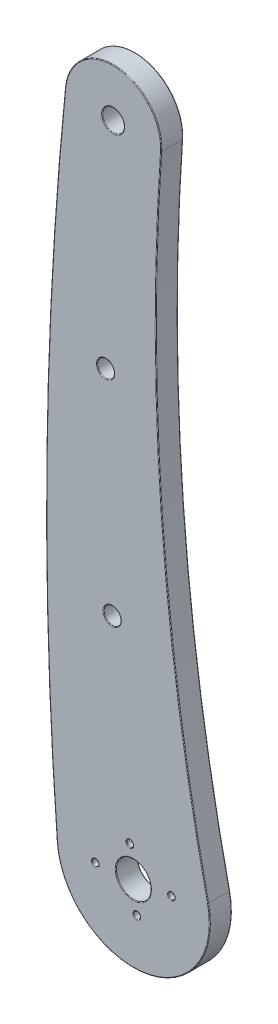
ISO-10303-21;
HEADER;
FILE_DESCRIPTION(('STEP AP214'),'2;1');
FILE_NAME('part.step','',(''),(''),'','','');
FILE_SCHEMA(('AUTOMOTIVE_DESIGN { 1 0 10303 214 1 1 1 1 }'));
ENDSEC;
DATA;
#1=APPLICATION_CONTEXT('core data for automotive mechanical design processes');
#2=APPLICATION_PROTOCOL_DEFINITION('international standard','automotive_design',2000,#1);
#3=PRODUCT_CONTEXT('',#1,'mechanical');
#4=PRODUCT('Part','Part','',(#3));
#5=PRODUCT_RELATED_PRODUCT_CATEGORY('part','',(#4));
#6=PRODUCT_DEFINITION_FORMATION('','',#4);
#7=PRODUCT_DEFINITION_CONTEXT('part definition',#1,'design');
#8=PRODUCT_DEFINITION('design','',#6,#7);
#9=PRODUCT_DEFINITION_SHAPE('','',#8);
#10=(LENGTH_UNIT() NAMED_UNIT(*) SI_UNIT(.MILLI.,.METRE.));
#11=(NAMED_UNIT(*) PLANE_ANGLE_UNIT() SI_UNIT($,.RADIAN.));
#12=(NAMED_UNIT(*) SI_UNIT($,.STERADIAN.) SOLID_ANGLE_UNIT());
#13=UNCERTAINTY_MEASURE_WITH_UNIT(LENGTH_MEASURE(1.E-05),#10,'distance_accuracy_value','');
#14=(GEOMETRIC_REPRESENTATION_CONTEXT(3) GLOBAL_UNCERTAINTY_ASSIGNED_CONTEXT((#13)) GLOBAL_UNIT_ASSIGNED_CONTEXT((#10,
#11,#12)) REPRESENTATION_CONTEXT('',''));
#15=CARTESIAN_POINT('',(0.,0.,0.));
#16=DIRECTION('',(0.,0.,1.));
#17=DIRECTION('',(1.,0.,0.));
#18=AXIS2_PLACEMENT_3D('',#15,#16,#17);
#19=CARTESIAN_POINT('',(230.031719248434,187.768140831656,0.));
#20=DIRECTION('',(0.,0.,-1.));
#21=DIRECTION('',(-1.,0.,0.));
#22=AXIS2_PLACEMENT_3D('',#19,#20,#21);
#23=PLANE('',#22);
#24=CARTESIAN_POINT('',(-25.0518691675999,107.3459827628,0.));
#25=DIRECTION('',(0.,0.,-1.));
#26=DIRECTION('',(-1.,0.,0.));
#27=AXIS2_PLACEMENT_3D('',#24,#25,#26);
#28=CIRCLE('',#27,2.09999999999999);
#29=CARTESIAN_POINT('',(-27.1518691675999,107.3459827628,0.));
#30=VERTEX_POINT('',#29);
#31=EDGE_CURVE('E11',#30,#30,#28,.T.);
#32=ORIENTED_EDGE('',*,*,#31,.T.);
#33=EDGE_LOOP('',(#32));
#34=FACE_BOUND('',#33,.T.);
#35=CARTESIAN_POINT('',(-26.5607552882577,155.536723367503,0.));
#36=DIRECTION('',(0.,0.,-1.));
#37=DIRECTION('',(-1.,0.,0.));
#38=AXIS2_PLACEMENT_3D('',#35,#36,#37);
#39=CIRCLE('',#38,2.09999999999999);
#40=CARTESIAN_POINT('',(-28.6607552882577,155.536723367503,0.));
#41=VERTEX_POINT('',#40);
#42=EDGE_CURVE('E46',#41,#41,#39,.T.);
#43=ORIENTED_EDGE('',*,*,#42,.T.);
#44=EDGE_LOOP('',(#43));
#45=FACE_BOUND('',#44,.T.);
#46=CARTESIAN_POINT('',(-20.2200000000001,57.5800000000009,0.));
#47=DIRECTION('',(0.,0.,-1.));
#48=DIRECTION('',(-1.,0.,0.));
#49=AXIS2_PLACEMENT_3D('',#46,#47,#48);
#50=CIRCLE('',#49,17.3500000000004);
#51=CARTESIAN_POINT('',(-37.5197670345466,56.2606969451915,0.));
#52=VERTEX_POINT('',#51);
#53=CARTESIAN_POINT('',(-3.28455090250884,61.3500217328686,0.));
#54=VERTEX_POINT('',#53);
#55=EDGE_CURVE('E54',#52,#54,#50,.F.);
#56=ORIENTED_EDGE('',*,*,#55,.T.);
#57=CARTESIAN_POINT('',(484.915153196055,170.028775029335,0.));
#58=DIRECTION('',(0.,0.,-1.));
#59=DIRECTION('',(-1.,0.,0.));
#60=AXIS2_PLACEMENT_3D('',#57,#58,#59);
#61=CIRCLE('',#60,500.15);
#62=CARTESIAN_POINT('',(-14.0278976411374,204.754191099906,0.));
#63=VERTEX_POINT('',#62);
#64=EDGE_CURVE('E257',#54,#63,#61,.T.);
#65=ORIENTED_EDGE('',*,*,#64,.T.);
#66=CARTESIAN_POINT('',(-24.8517146991871,205.507506633977,0.));
#67=DIRECTION('',(0.,0.,-1.));
#68=DIRECTION('',(-1.,0.,0.));
#69=AXIS2_PLACEMENT_3D('',#66,#67,#68);
#70=CIRCLE('',#69,10.8500000000001);
#71=CARTESIAN_POINT('',(-35.6463835909482,206.601866500405,0.));
#72=VERTEX_POINT('',#71);
#73=EDGE_CURVE('E253',#63,#72,#70,.F.);
#74=ORIENTED_EDGE('',*,*,#73,.T.);
#75=CARTESIAN_POINT('',(809.869686239751,120.883734474283,0.));
#76=DIRECTION('',(0.,0.,-1.));
#77=DIRECTION('',(-1.,0.,0.));
#78=AXIS2_PLACEMENT_3D('',#75,#76,#77);
#79=CIRCLE('',#78,849.85);
#80=EDGE_CURVE('E59',#72,#52,#79,.F.);
#81=ORIENTED_EDGE('',*,*,#80,.T.);
#82=EDGE_LOOP('',(#56,#65,#74,#81));
#83=FACE_BOUND('',#82,.T.);
#84=CARTESIAN_POINT('',(-24.8517146991871,205.507506633977,0.));
#85=DIRECTION('',(0.,0.,-1.));
#86=DIRECTION('',(-1.,0.,0.));
#87=AXIS2_PLACEMENT_3D('',#84,#85,#86);
#88=CIRCLE('',#87,2.65);
#89=CARTESIAN_POINT('',(-27.5017146991871,205.507506633977,0.));
#90=VERTEX_POINT('',#89);
#91=EDGE_CURVE('E250',#90,#90,#88,.T.);
#92=ORIENTED_EDGE('',*,*,#91,.T.);
#93=EDGE_LOOP('',(#92));
#94=FACE_BOUND('',#93,.T.);
#95=CARTESIAN_POINT('',(-20.2200000000001,57.5800000000009,0.));
#96=DIRECTION('',(0.,0.,-1.));
#97=DIRECTION('',(-1.,0.,0.));
#98=AXIS2_PLACEMENT_3D('',#95,#96,#97);
#99=CIRCLE('',#98,4.15);
#100=CARTESIAN_POINT('',(-24.3700000000001,57.5800000000009,0.));
#101=VERTEX_POINT('',#100);
#102=EDGE_CURVE('E247',#101,#101,#99,.T.);
#103=ORIENTED_EDGE('',*,*,#102,.T.);
#104=EDGE_LOOP('',(#103));
#105=FACE_BOUND('',#104,.T.);
#106=CARTESIAN_POINT('',(-21.0271976529339,64.2815619036988,0.));
#107=DIRECTION('',(0.,0.,-1.));
#108=DIRECTION('',(-1.,0.,0.));
#109=AXIS2_PLACEMENT_3D('',#106,#107,#108);
#110=CIRCLE('',#109,0.899999999984444);
#111=CARTESIAN_POINT('',(-21.9271976529184,64.2815619036988,0.));
#112=VERTEX_POINT('',#111);
#113=EDGE_CURVE('E244',#112,#112,#110,.T.);
#114=ORIENTED_EDGE('',*,*,#113,.T.);
#115=EDGE_LOOP('',(#114));
#116=FACE_BOUND('',#115,.T.);
#117=CARTESIAN_POINT('',(-28.9072098751638,56.5336326721225,0.));
#118=DIRECTION('',(0.,0.,-1.));
#119=DIRECTION('',(-1.,0.,0.));
#120=AXIS2_PLACEMENT_3D('',#117,#118,#119);
#121=CIRCLE('',#120,0.899999999964044);
#122=CARTESIAN_POINT('',(-29.8072098751278,56.5336326721225,0.));
#123=VERTEX_POINT('',#122);
#124=EDGE_CURVE('E241',#123,#123,#121,.T.);
#125=ORIENTED_EDGE('',*,*,#124,.T.);
#126=EDGE_LOOP('',(#125));
#127=FACE_BOUND('',#126,.T.);
#128=CARTESIAN_POINT('',(-11.5327901248355,58.6263673278785,0.));
#129=DIRECTION('',(0.,0.,-1.));
#130=DIRECTION('',(-1.,0.,0.));
#131=AXIS2_PLACEMENT_3D('',#128,#129,#130);
#132=CIRCLE('',#131,0.89999999992151);
#133=CARTESIAN_POINT('',(-12.432790124757,58.6263673278785,0.));
#134=VERTEX_POINT('',#133);
#135=EDGE_CURVE('E238',#134,#134,#132,.T.);
#136=ORIENTED_EDGE('',*,*,#135,.T.);
#137=EDGE_LOOP('',(#136));
#138=FACE_BOUND('',#137,.T.);
#139=CARTESIAN_POINT('',(-19.4128023470652,50.8784380963026,0.));
#140=DIRECTION('',(0.,0.,-1.));
#141=DIRECTION('',(-1.,0.,0.));
#142=AXIS2_PLACEMENT_3D('',#139,#140,#141);
#143=CIRCLE('',#142,0.89999999980172);
#144=CARTESIAN_POINT('',(-20.3128023468669,50.8784380963026,0.));
#145=VERTEX_POINT('',#144);
#146=EDGE_CURVE('E235',#145,#145,#143,.T.);
#147=ORIENTED_EDGE('',*,*,#146,.T.);
#148=EDGE_LOOP('',(#147));
#149=FACE_BOUND('',#148,.T.);
#150=ADVANCED_FACE('F37',(#34,#45,#83,#94,#105,#116,#127,#138,#149),#23,.F.);
#151=CARTESIAN_POINT('',(-24.8517146991871,205.507506633977,-5.));
#152=DIRECTION('',(0.,0.,1.));
#153=DIRECTION('',(1.,0.,0.));
#154=AXIS2_PLACEMENT_3D('',#151,#152,#153);
#155=CYLINDRICAL_SURFACE('',#154,11.0000000000001);
#156=DIRECTION('',(0.,0.,1.));
#157=VECTOR('',#156,1.);
#158=CARTESIAN_POINT('',(-13.8782596172934,204.743776599435,-5.));
#159=LINE('',#158,#157);
#160=CARTESIAN_POINT('',(-13.8782596172934,204.743776599435,-4.85));
#161=VERTEX_POINT('',#160);
#162=CARTESIAN_POINT('',(-13.8782596172934,204.743776599435,-0.15));
#163=VERTEX_POINT('',#162);
#164=EDGE_CURVE('E111',#161,#163,#159,.T.);
#165=ORIENTED_EDGE('',*,*,#164,.F.);
#166=CARTESIAN_POINT('',(-24.8517146991871,205.507506633977,-4.85));
#167=DIRECTION('',(0.,0.,-1.));
#168=DIRECTION('',(-1.,0.,0.));
#169=AXIS2_PLACEMENT_3D('',#166,#167,#168);
#170=CIRCLE('',#169,11.0000000000001);
#171=CARTESIAN_POINT('',(-35.7956186447514,206.61699589948,-4.85));
#172=VERTEX_POINT('',#171);
#173=EDGE_CURVE('E105',#161,#172,#170,.F.);
#174=ORIENTED_EDGE('',*,*,#173,.T.);
#175=DIRECTION('',(0.,0.,1.));
#176=VECTOR('',#175,1.);
#177=CARTESIAN_POINT('',(-35.7956186447514,206.61699589948,-5.));
#178=LINE('',#177,#176);
#179=CARTESIAN_POINT('',(-35.7956186447514,206.61699589948,-0.15));
#180=VERTEX_POINT('',#179);
#181=EDGE_CURVE('E108',#172,#180,#178,.T.);
#182=ORIENTED_EDGE('',*,*,#181,.T.);
#183=CARTESIAN_POINT('',(-24.8517146991871,205.507506633977,-0.15));
#184=DIRECTION('',(0.,0.,-1.));
#185=DIRECTION('',(-1.,0.,0.));
#186=AXIS2_PLACEMENT_3D('',#183,#184,#185);
#187=CIRCLE('',#186,11.0000000000001);
#188=EDGE_CURVE('E117',#180,#163,#187,.T.);
#189=ORIENTED_EDGE('',*,*,#188,.T.);
#190=EDGE_LOOP('',(#165,#174,#182,#189));
#191=FACE_BOUND('',#190,.T.);
#192=ADVANCED_FACE('F107',(#191),#155,.T.);
#193=CARTESIAN_POINT('',(484.915153196055,170.028775029335,-5.));
#194=DIRECTION('',(0.,0.,1.));
#195=DIRECTION('',(1.,0.,0.));
#196=AXIS2_PLACEMENT_3D('',#193,#194,#195);
#197=CYLINDRICAL_SURFACE('',#196,500.);
#198=DIRECTION('',(0.,0.,1.));
#199=VECTOR('',#198,1.);
#200=CARTESIAN_POINT('',(-3.13813491607529,61.3826155807032,-5.));
#201=LINE('',#200,#199);
#202=CARTESIAN_POINT('',(-3.13813491607529,61.3826155807032,-4.85));
#203=VERTEX_POINT('',#202);
#204=CARTESIAN_POINT('',(-3.13813491607529,61.3826155807032,-0.15));
#205=VERTEX_POINT('',#204);
#206=EDGE_CURVE('E287',#203,#205,#201,.T.);
#207=ORIENTED_EDGE('',*,*,#206,.F.);
#208=CARTESIAN_POINT('',(484.915153196055,170.028775029335,-4.85));
#209=DIRECTION('',(0.,0.,-1.));
#210=DIRECTION('',(-1.,0.,0.));
#211=AXIS2_PLACEMENT_3D('',#208,#209,#210);
#212=CIRCLE('',#211,500.);
#213=EDGE_CURVE('E185',#203,#161,#212,.T.);
#214=ORIENTED_EDGE('',*,*,#213,.T.);
#215=ORIENTED_EDGE('',*,*,#164,.T.);
#216=CARTESIAN_POINT('',(484.915153196055,170.028775029335,-0.15));
#217=DIRECTION('',(0.,0.,-1.));
#218=DIRECTION('',(-1.,0.,0.));
#219=AXIS2_PLACEMENT_3D('',#216,#217,#218);
#220=CIRCLE('',#219,500.);
#221=EDGE_CURVE('E182',#163,#205,#220,.F.);
#222=ORIENTED_EDGE('',*,*,#221,.T.);
#223=EDGE_LOOP('',(#207,#214,#215,#222));
#224=FACE_BOUND('',#223,.T.);
#225=ADVANCED_FACE('F284',(#224),#197,.F.);
#226=CARTESIAN_POINT('',(-20.2200000000001,57.5800000000009,-5.));
#227=DIRECTION('',(0.,0.,1.));
#228=DIRECTION('',(1.,0.,0.));
#229=AXIS2_PLACEMENT_3D('',#226,#227,#228);
#230=CYLINDRICAL_SURFACE('',#229,17.5000000000004);
#231=DIRECTION('',(0.,0.,1.));
#232=VECTOR('',#231,1.);
#233=CARTESIAN_POINT('',(-37.669332743779,56.2492908669078,-5.));
#234=LINE('',#233,#232);
#235=CARTESIAN_POINT('',(-37.669332743779,56.2492908669078,-4.85));
#236=VERTEX_POINT('',#235);
#237=CARTESIAN_POINT('',(-37.669332743779,56.2492908669078,-0.15));
#238=VERTEX_POINT('',#237);
#239=EDGE_CURVE('E128',#236,#238,#234,.T.);
#240=ORIENTED_EDGE('',*,*,#239,.F.);
#241=CARTESIAN_POINT('',(-20.2200000000001,57.5800000000009,-4.85));
#242=DIRECTION('',(0.,0.,-1.));
#243=DIRECTION('',(-1.,0.,0.));
#244=AXIS2_PLACEMENT_3D('',#241,#242,#243);
#245=CIRCLE('',#244,17.5000000000004);
#246=EDGE_CURVE('E180',#236,#203,#245,.F.);
#247=ORIENTED_EDGE('',*,*,#246,.T.);
#248=ORIENTED_EDGE('',*,*,#206,.T.);
#249=CARTESIAN_POINT('',(-20.2200000000001,57.5800000000009,-0.15));
#250=DIRECTION('',(0.,0.,-1.));
#251=DIRECTION('',(-1.,0.,0.));
#252=AXIS2_PLACEMENT_3D('',#249,#250,#251);
#253=CIRCLE('',#252,17.5000000000004);
#254=EDGE_CURVE('E178',#205,#238,#253,.T.);
#255=ORIENTED_EDGE('',*,*,#254,.T.);
#256=EDGE_LOOP('',(#240,#247,#248,#255));
#257=FACE_BOUND('',#256,.T.);
#258=ADVANCED_FACE('F352',(#257),#230,.T.);
#259=CARTESIAN_POINT('',(809.869686239751,120.883734474283,-5.));
#260=DIRECTION('',(0.,0.,1.));
#261=DIRECTION('',(1.,0.,0.));
#262=AXIS2_PLACEMENT_3D('',#259,#260,#261);
#263=CYLINDRICAL_SURFACE('',#262,850.);
#264=ORIENTED_EDGE('',*,*,#181,.F.);
#265=CARTESIAN_POINT('',(809.869686239751,120.883734474283,-4.85));
#266=DIRECTION('',(0.,0.,-1.));
#267=DIRECTION('',(-1.,0.,0.));
#268=AXIS2_PLACEMENT_3D('',#265,#266,#267);
#269=CIRCLE('',#268,850.);
#270=EDGE_CURVE('E124',#172,#236,#269,.F.);
#271=ORIENTED_EDGE('',*,*,#270,.T.);
#272=ORIENTED_EDGE('',*,*,#239,.T.);
#273=CARTESIAN_POINT('',(809.869686239751,120.883734474283,-0.15));
#274=DIRECTION('',(0.,0.,-1.));
#275=DIRECTION('',(-1.,0.,0.));
#276=AXIS2_PLACEMENT_3D('',#273,#274,#275);
#277=CIRCLE('',#276,850.);
#278=EDGE_CURVE('E127',#238,#180,#277,.T.);
#279=ORIENTED_EDGE('',*,*,#278,.T.);
#280=EDGE_LOOP('',(#264,#271,#272,#279));
#281=FACE_BOUND('',#280,.T.);
#282=ADVANCED_FACE('F121',(#281),#263,.T.);
#283=CARTESIAN_POINT('',(230.031719248434,187.768140831656,-5.));
#284=DIRECTION('',(0.,0.,-1.));
#285=DIRECTION('',(-1.,0.,0.));
#286=AXIS2_PLACEMENT_3D('',#283,#284,#285);
#287=PLANE('',#286);
#288=CARTESIAN_POINT('',(-20.2200000000001,57.5800000000009,-5.));
#289=DIRECTION('',(0.,0.,-1.));
#290=DIRECTION('',(-1.,0.,0.));
#291=AXIS2_PLACEMENT_3D('',#288,#289,#290);
#292=CIRCLE('',#291,17.3500000000004);
#293=CARTESIAN_POINT('',(-3.28455090250894,61.3500217328686,-5.));
#294=VERTEX_POINT('',#293);
#295=CARTESIAN_POINT('',(-37.5197670345466,56.2606969451915,-5.));
#296=VERTEX_POINT('',#295);
#297=EDGE_CURVE('E174',#294,#296,#292,.T.);
#298=ORIENTED_EDGE('',*,*,#297,.T.);
#299=CARTESIAN_POINT('',(809.869686239751,120.883734474283,-5.));
#300=DIRECTION('',(0.,0.,-1.));
#301=DIRECTION('',(-1.,0.,0.));
#302=AXIS2_PLACEMENT_3D('',#299,#300,#301);
#303=CIRCLE('',#302,849.85);
#304=CARTESIAN_POINT('',(-35.6463835909482,206.601866500405,-5.));
#305=VERTEX_POINT('',#304);
#306=EDGE_CURVE('E176',#296,#305,#303,.T.);
#307=ORIENTED_EDGE('',*,*,#306,.T.);
#308=CARTESIAN_POINT('',(-24.8517146991871,205.507506633977,-5.));
#309=DIRECTION('',(0.,0.,-1.));
#310=DIRECTION('',(-1.,0.,0.));
#311=AXIS2_PLACEMENT_3D('',#308,#309,#310);
#312=CIRCLE('',#311,10.8500000000001);
#313=CARTESIAN_POINT('',(-14.0278976411374,204.754191099906,-5.));
#314=VERTEX_POINT('',#313);
#315=EDGE_CURVE('E134',#305,#314,#312,.T.);
#316=ORIENTED_EDGE('',*,*,#315,.T.);
#317=CARTESIAN_POINT('',(484.915153196055,170.028775029335,-5.));
#318=DIRECTION('',(0.,0.,-1.));
#319=DIRECTION('',(-1.,0.,0.));
#320=AXIS2_PLACEMENT_3D('',#317,#318,#319);
#321=CIRCLE('',#320,500.15);
#322=EDGE_CURVE('E172',#314,#294,#321,.F.);
#323=ORIENTED_EDGE('',*,*,#322,.T.);
#324=EDGE_LOOP('',(#298,#307,#316,#323));
#325=FACE_BOUND('',#324,.T.);
#326=CARTESIAN_POINT('',(-24.8517146991871,205.507506633977,-5.));
#327=DIRECTION('',(0.,0.,-1.));
#328=DIRECTION('',(-1.,0.,0.));
#329=AXIS2_PLACEMENT_3D('',#326,#327,#328);
#330=CIRCLE('',#329,2.65);
#331=CARTESIAN_POINT('',(-27.5017146991871,205.507506633977,-5.));
#332=VERTEX_POINT('',#331);
#333=EDGE_CURVE('E168',#332,#332,#330,.F.);
#334=ORIENTED_EDGE('',*,*,#333,.T.);
#335=EDGE_LOOP('',(#334));
#336=FACE_BOUND('',#335,.T.);
#337=CARTESIAN_POINT('',(-20.2200000000001,57.5800000000009,-5.));
#338=DIRECTION('',(0.,0.,-1.));
#339=DIRECTION('',(-1.,0.,0.));
#340=AXIS2_PLACEMENT_3D('',#337,#338,#339);
#341=CIRCLE('',#340,4.15);
#342=CARTESIAN_POINT('',(-24.3700000000001,57.5800000000009,-5.));
#343=VERTEX_POINT('',#342);
#344=EDGE_CURVE('E165',#343,#343,#341,.F.);
#345=ORIENTED_EDGE('',*,*,#344,.T.);
#346=EDGE_LOOP('',(#345));
#347=FACE_BOUND('',#346,.T.);
#348=CARTESIAN_POINT('',(-21.0271976529339,64.2815619036988,-5.));
#349=DIRECTION('',(0.,0.,-1.));
#350=DIRECTION('',(-1.,0.,0.));
#351=AXIS2_PLACEMENT_3D('',#348,#349,#350);
#352=CIRCLE('',#351,0.899999999984444);
#353=CARTESIAN_POINT('',(-21.9271976529184,64.2815619036988,-5.));
#354=VERTEX_POINT('',#353);
#355=EDGE_CURVE('E162',#354,#354,#352,.F.);
#356=ORIENTED_EDGE('',*,*,#355,.T.);
#357=EDGE_LOOP('',(#356));
#358=FACE_BOUND('',#357,.T.);
#359=CARTESIAN_POINT('',(-28.9072098751638,56.5336326721225,-5.));
#360=DIRECTION('',(0.,0.,-1.));
#361=DIRECTION('',(-1.,0.,0.));
#362=AXIS2_PLACEMENT_3D('',#359,#360,#361);
#363=CIRCLE('',#362,0.899999999964044);
#364=CARTESIAN_POINT('',(-29.8072098751278,56.5336326721225,-5.));
#365=VERTEX_POINT('',#364);
#366=EDGE_CURVE('E159',#365,#365,#363,.F.);
#367=ORIENTED_EDGE('',*,*,#366,.T.);
#368=EDGE_LOOP('',(#367));
#369=FACE_BOUND('',#368,.T.);
#370=CARTESIAN_POINT('',(-11.5327901248355,58.6263673278785,-5.));
#371=DIRECTION('',(0.,0.,-1.));
#372=DIRECTION('',(-1.,0.,0.));
#373=AXIS2_PLACEMENT_3D('',#370,#371,#372);
#374=CIRCLE('',#373,0.89999999992151);
#375=CARTESIAN_POINT('',(-12.432790124757,58.6263673278785,-5.));
#376=VERTEX_POINT('',#375);
#377=EDGE_CURVE('E156',#376,#376,#374,.F.);
#378=ORIENTED_EDGE('',*,*,#377,.T.);
#379=EDGE_LOOP('',(#378));
#380=FACE_BOUND('',#379,.T.);
#381=CARTESIAN_POINT('',(-19.4128023470652,50.8784380963026,-5.));
#382=DIRECTION('',(0.,0.,-1.));
#383=DIRECTION('',(-1.,0.,0.));
#384=AXIS2_PLACEMENT_3D('',#381,#382,#383);
#385=CIRCLE('',#384,0.89999999980172);
#386=CARTESIAN_POINT('',(-20.3128023468669,50.8784380963026,-5.));
#387=VERTEX_POINT('',#386);
#388=EDGE_CURVE('E153',#387,#387,#385,.F.);
#389=ORIENTED_EDGE('',*,*,#388,.T.);
#390=EDGE_LOOP('',(#389));
#391=FACE_BOUND('',#390,.T.);
#392=CARTESIAN_POINT('',(-26.5607552882577,155.536723367503,-5.));
#393=DIRECTION('',(0.,0.,-1.));
#394=DIRECTION('',(-1.,0.,0.));
#395=AXIS2_PLACEMENT_3D('',#392,#393,#394);
#396=CIRCLE('',#395,2.09999999999999);
#397=CARTESIAN_POINT('',(-28.6607552882577,155.536723367503,-5.));
#398=VERTEX_POINT('',#397);
#399=EDGE_CURVE('E147',#398,#398,#396,.F.);
#400=ORIENTED_EDGE('',*,*,#399,.T.);
#401=EDGE_LOOP('',(#400));
#402=FACE_BOUND('',#401,.T.);
#403=CARTESIAN_POINT('',(-25.0518691675999,107.3459827628,-5.));
#404=DIRECTION('',(0.,0.,-1.));
#405=DIRECTION('',(-1.,0.,0.));
#406=AXIS2_PLACEMENT_3D('',#403,#404,#405);
#407=CIRCLE('',#406,2.09999999999999);
#408=CARTESIAN_POINT('',(-27.1518691675999,107.3459827628,-5.));
#409=VERTEX_POINT('',#408);
#410=EDGE_CURVE('E144',#409,#409,#407,.F.);
#411=ORIENTED_EDGE('',*,*,#410,.T.);
#412=EDGE_LOOP('',(#411));
#413=FACE_BOUND('',#412,.T.);
#414=ADVANCED_FACE('F345',(#325,#336,#347,#358,#369,#380,#391,#402,#413),#287,.T.);
#415=CARTESIAN_POINT('',(-24.8517146991871,205.507506633977,-5.));
#416=DIRECTION('',(0.,0.,1.));
#417=DIRECTION('',(1.,0.,0.));
#418=AXIS2_PLACEMENT_3D('',#415,#416,#417);
#419=CYLINDRICAL_SURFACE('',#418,2.5);
#420=CARTESIAN_POINT('',(-24.8517146991871,205.507506633977,-4.85));
#421=DIRECTION('',(0.,0.,-1.));
#422=DIRECTION('',(-1.,0.,0.));
#423=AXIS2_PLACEMENT_3D('',#420,#421,#422);
#424=CIRCLE('',#423,2.5);
#425=CARTESIAN_POINT('',(-27.3517146991871,205.507506633977,-4.85));
#426=VERTEX_POINT('',#425);
#427=EDGE_CURVE('E190',#426,#426,#424,.T.);
#428=ORIENTED_EDGE('',*,*,#427,.T.);
#429=EDGE_LOOP('',(#428));
#430=FACE_BOUND('',#429,.T.);
#431=CARTESIAN_POINT('',(-24.8517146991871,205.507506633977,-0.15));
#432=DIRECTION('',(0.,0.,-1.));
#433=DIRECTION('',(-1.,0.,0.));
#434=AXIS2_PLACEMENT_3D('',#431,#432,#433);
#435=CIRCLE('',#434,2.5);
#436=CARTESIAN_POINT('',(-27.3517146991871,205.507506633977,-0.15));
#437=VERTEX_POINT('',#436);
#438=EDGE_CURVE('E116',#437,#437,#435,.F.);
#439=ORIENTED_EDGE('',*,*,#438,.T.);
#440=EDGE_LOOP('',(#439));
#441=FACE_BOUND('',#440,.T.);
#442=ADVANCED_FACE('F341',(#430,#441),#419,.F.);
#443=CARTESIAN_POINT('',(-20.2200000000001,57.5800000000009,-5.));
#444=DIRECTION('',(0.,0.,1.));
#445=DIRECTION('',(1.,0.,0.));
#446=AXIS2_PLACEMENT_3D('',#443,#444,#445);
#447=CYLINDRICAL_SURFACE('',#446,4.);
#448=CARTESIAN_POINT('',(-20.2200000000001,57.5800000000009,-4.85));
#449=DIRECTION('',(0.,0.,-1.));
#450=DIRECTION('',(-1.,0.,0.));
#451=AXIS2_PLACEMENT_3D('',#448,#449,#450);
#452=CIRCLE('',#451,4.);
#453=CARTESIAN_POINT('',(-24.2200000000001,57.5800000000009,-4.85));
#454=VERTEX_POINT('',#453);
#455=EDGE_CURVE('E196',#454,#454,#452,.T.);
#456=ORIENTED_EDGE('',*,*,#455,.T.);
#457=EDGE_LOOP('',(#456));
#458=FACE_BOUND('',#457,.T.);
#459=CARTESIAN_POINT('',(-20.2200000000001,57.5800000000009,-0.15));
#460=DIRECTION('',(0.,0.,-1.));
#461=DIRECTION('',(-1.,0.,0.));
#462=AXIS2_PLACEMENT_3D('',#459,#460,#461);
#463=CIRCLE('',#462,4.);
#464=CARTESIAN_POINT('',(-24.2200000000001,57.5800000000009,-0.15));
#465=VERTEX_POINT('',#464);
#466=EDGE_CURVE('E193',#465,#465,#463,.F.);
#467=ORIENTED_EDGE('',*,*,#466,.T.);
#468=EDGE_LOOP('',(#467));
#469=FACE_BOUND('',#468,.T.);
#470=ADVANCED_FACE('F337',(#458,#469),#447,.F.);
#471=CARTESIAN_POINT('',(-21.0271976529339,64.2815619036988,-5.));
#472=DIRECTION('',(0.,0.,1.));
#473=DIRECTION('',(1.,0.,0.));
#474=AXIS2_PLACEMENT_3D('',#471,#472,#473);
#475=CYLINDRICAL_SURFACE('',#474,0.749999999984444);
#476=CARTESIAN_POINT('',(-21.0271976529339,64.2815619036988,-4.85));
#477=DIRECTION('',(0.,0.,-1.));
#478=DIRECTION('',(-1.,0.,0.));
#479=AXIS2_PLACEMENT_3D('',#476,#477,#478);
#480=CIRCLE('',#479,0.749999999984444);
#481=CARTESIAN_POINT('',(-21.7771976529184,64.2815619036988,-4.85));
#482=VERTEX_POINT('',#481);
#483=EDGE_CURVE('E202',#482,#482,#480,.T.);
#484=ORIENTED_EDGE('',*,*,#483,.T.);
#485=EDGE_LOOP('',(#484));
#486=FACE_BOUND('',#485,.T.);
#487=CARTESIAN_POINT('',(-21.0271976529339,64.2815619036988,-0.15));
#488=DIRECTION('',(0.,0.,-1.));
#489=DIRECTION('',(-1.,0.,0.));
#490=AXIS2_PLACEMENT_3D('',#487,#488,#489);
#491=CIRCLE('',#490,0.749999999984444);
#492=CARTESIAN_POINT('',(-21.7771976529184,64.2815619036988,-0.15));
#493=VERTEX_POINT('',#492);
#494=EDGE_CURVE('E199',#493,#493,#491,.F.);
#495=ORIENTED_EDGE('',*,*,#494,.T.);
#496=EDGE_LOOP('',(#495));
#497=FACE_BOUND('',#496,.T.);
#498=ADVANCED_FACE('F333',(#486,#497),#475,.F.);
#499=CARTESIAN_POINT('',(-28.9072098751638,56.5336326721225,-5.));
#500=DIRECTION('',(0.,0.,1.));
#501=DIRECTION('',(1.,0.,0.));
#502=AXIS2_PLACEMENT_3D('',#499,#500,#501);
#503=CYLINDRICAL_SURFACE('',#502,0.749999999964044);
#504=CARTESIAN_POINT('',(-28.9072098751638,56.5336326721225,-4.85));
#505=DIRECTION('',(0.,0.,-1.));
#506=DIRECTION('',(-1.,0.,0.));
#507=AXIS2_PLACEMENT_3D('',#504,#505,#506);
#508=CIRCLE('',#507,0.749999999964044);
#509=CARTESIAN_POINT('',(-29.6572098751278,56.5336326721225,-4.85));
#510=VERTEX_POINT('',#509);
#511=EDGE_CURVE('E208',#510,#510,#508,.T.);
#512=ORIENTED_EDGE('',*,*,#511,.T.);
#513=EDGE_LOOP('',(#512));
#514=FACE_BOUND('',#513,.T.);
#515=CARTESIAN_POINT('',(-28.9072098751638,56.5336326721225,-0.15));
#516=DIRECTION('',(0.,0.,-1.));
#517=DIRECTION('',(-1.,0.,0.));
#518=AXIS2_PLACEMENT_3D('',#515,#516,#517);
#519=CIRCLE('',#518,0.749999999964044);
#520=CARTESIAN_POINT('',(-29.6572098751278,56.5336326721225,-0.15));
#521=VERTEX_POINT('',#520);
#522=EDGE_CURVE('E205',#521,#521,#519,.F.);
#523=ORIENTED_EDGE('',*,*,#522,.T.);
#524=EDGE_LOOP('',(#523));
#525=FACE_BOUND('',#524,.T.);
#526=ADVANCED_FACE('F326',(#514,#525),#503,.F.);
#527=CARTESIAN_POINT('',(-11.5327901248355,58.6263673278785,-5.));
#528=DIRECTION('',(0.,0.,1.));
#529=DIRECTION('',(1.,0.,0.));
#530=AXIS2_PLACEMENT_3D('',#527,#528,#529);
#531=CYLINDRICAL_SURFACE('',#530,0.74999999992151);
#532=CARTESIAN_POINT('',(-11.5327901248355,58.6263673278785,-4.85));
#533=DIRECTION('',(0.,0.,-1.));
#534=DIRECTION('',(-1.,0.,0.));
#535=AXIS2_PLACEMENT_3D('',#532,#533,#534);
#536=CIRCLE('',#535,0.74999999992151);
#537=CARTESIAN_POINT('',(-12.282790124757,58.6263673278785,-4.85));
#538=VERTEX_POINT('',#537);
#539=EDGE_CURVE('E214',#538,#538,#536,.T.);
#540=ORIENTED_EDGE('',*,*,#539,.T.);
#541=EDGE_LOOP('',(#540));
#542=FACE_BOUND('',#541,.T.);
#543=CARTESIAN_POINT('',(-11.5327901248355,58.6263673278785,-0.15));
#544=DIRECTION('',(0.,0.,-1.));
#545=DIRECTION('',(-1.,0.,0.));
#546=AXIS2_PLACEMENT_3D('',#543,#544,#545);
#547=CIRCLE('',#546,0.74999999992151);
#548=CARTESIAN_POINT('',(-12.282790124757,58.6263673278785,-0.15));
#549=VERTEX_POINT('',#548);
#550=EDGE_CURVE('E211',#549,#549,#547,.F.);
#551=ORIENTED_EDGE('',*,*,#550,.T.);
#552=EDGE_LOOP('',(#551));
#553=FACE_BOUND('',#552,.T.);
#554=ADVANCED_FACE('F316',(#542,#553),#531,.F.);
#555=CARTESIAN_POINT('',(-19.4128023470652,50.8784380963026,-5.));
#556=DIRECTION('',(0.,0.,1.));
#557=DIRECTION('',(1.,0.,0.));
#558=AXIS2_PLACEMENT_3D('',#555,#556,#557);
#559=CYLINDRICAL_SURFACE('',#558,0.74999999980172);
#560=CARTESIAN_POINT('',(-19.4128023470652,50.8784380963026,-4.85));
#561=DIRECTION('',(0.,0.,-1.));
#562=DIRECTION('',(-1.,0.,0.));
#563=AXIS2_PLACEMENT_3D('',#560,#561,#562);
#564=CIRCLE('',#563,0.74999999980172);
#565=CARTESIAN_POINT('',(-20.1628023468669,50.8784380963026,-4.85));
#566=VERTEX_POINT('',#565);
#567=EDGE_CURVE('E220',#566,#566,#564,.T.);
#568=ORIENTED_EDGE('',*,*,#567,.T.);
#569=EDGE_LOOP('',(#568));
#570=FACE_BOUND('',#569,.T.);
#571=CARTESIAN_POINT('',(-19.4128023470652,50.8784380963026,-0.15));
#572=DIRECTION('',(0.,0.,-1.));
#573=DIRECTION('',(-1.,0.,0.));
#574=AXIS2_PLACEMENT_3D('',#571,#572,#573);
#575=CIRCLE('',#574,0.74999999980172);
#576=CARTESIAN_POINT('',(-20.1628023468669,50.8784380963026,-0.15));
#577=VERTEX_POINT('',#576);
#578=EDGE_CURVE('E217',#577,#577,#575,.F.);
#579=ORIENTED_EDGE('',*,*,#578,.T.);
#580=EDGE_LOOP('',(#579));
#581=FACE_BOUND('',#580,.T.);
#582=ADVANCED_FACE('F313',(#570,#581),#559,.F.);
#583=CARTESIAN_POINT('',(-26.5607552882577,155.536723367503,0.));
#584=DIRECTION('',(0.,0.,1.));
#585=DIRECTION('',(1.,0.,0.));
#586=AXIS2_PLACEMENT_3D('',#583,#584,#585);
#587=CYLINDRICAL_SURFACE('',#586,1.94999999999999);
#588=CARTESIAN_POINT('',(-26.5607552882577,155.536723367503,-4.85));
#589=DIRECTION('',(0.,0.,-1.));
#590=DIRECTION('',(-1.,0.,0.));
#591=AXIS2_PLACEMENT_3D('',#588,#589,#590);
#592=CIRCLE('',#591,1.94999999999999);
#593=CARTESIAN_POINT('',(-28.5107552882577,155.536723367503,-4.85));
#594=VERTEX_POINT('',#593);
#595=EDGE_CURVE('E226',#594,#594,#592,.T.);
#596=ORIENTED_EDGE('',*,*,#595,.T.);
#597=EDGE_LOOP('',(#596));
#598=FACE_BOUND('',#597,.T.);
#599=CARTESIAN_POINT('',(-26.5607552882577,155.536723367503,-0.15));
#600=DIRECTION('',(0.,0.,-1.));
#601=DIRECTION('',(-1.,0.,0.));
#602=AXIS2_PLACEMENT_3D('',#599,#600,#601);
#603=CIRCLE('',#602,1.94999999999999);
#604=CARTESIAN_POINT('',(-28.5107552882577,155.536723367503,-0.15));
#605=VERTEX_POINT('',#604);
#606=EDGE_CURVE('E223',#605,#605,#603,.F.);
#607=ORIENTED_EDGE('',*,*,#606,.T.);
#608=EDGE_LOOP('',(#607));
#609=FACE_BOUND('',#608,.T.);
#610=ADVANCED_FACE('F315',(#598,#609),#587,.F.);
#611=CARTESIAN_POINT('',(-25.0518691675999,107.3459827628,0.));
#612=DIRECTION('',(0.,0.,1.));
#613=DIRECTION('',(1.,0.,0.));
#614=AXIS2_PLACEMENT_3D('',#611,#612,#613);
#615=CYLINDRICAL_SURFACE('',#614,1.94999999999999);
#616=CARTESIAN_POINT('',(-25.0518691675999,107.3459827628,-4.85));
#617=DIRECTION('',(0.,0.,-1.));
#618=DIRECTION('',(-1.,0.,0.));
#619=AXIS2_PLACEMENT_3D('',#616,#617,#618);
#620=CIRCLE('',#619,1.94999999999999);
#621=CARTESIAN_POINT('',(-27.0018691675999,107.3459827628,-4.85));
#622=VERTEX_POINT('',#621);
#623=EDGE_CURVE('E232',#622,#622,#620,.T.);
#624=ORIENTED_EDGE('',*,*,#623,.T.);
#625=EDGE_LOOP('',(#624));
#626=FACE_BOUND('',#625,.T.);
#627=CARTESIAN_POINT('',(-25.0518691675999,107.3459827628,-0.15));
#628=DIRECTION('',(0.,0.,-1.));
#629=DIRECTION('',(-1.,0.,0.));
#630=AXIS2_PLACEMENT_3D('',#627,#628,#629);
#631=CIRCLE('',#630,1.94999999999999);
#632=CARTESIAN_POINT('',(-27.0018691675999,107.3459827628,-0.15));
#633=VERTEX_POINT('',#632);
#634=EDGE_CURVE('E229',#633,#633,#631,.F.);
#635=ORIENTED_EDGE('',*,*,#634,.T.);
#636=EDGE_LOOP('',(#635));
#637=FACE_BOUND('',#636,.T.);
#638=ADVANCED_FACE('F323',(#626,#637),#615,.F.);
#639=CARTESIAN_POINT('',(484.915153196055,170.028775029335,-4.85));
#640=DIRECTION('',(0.,0.,-1.));
#641=DIRECTION('',(-1.,0.,0.));
#642=AXIS2_PLACEMENT_3D('',#639,#640,#641);
#643=TOROIDAL_SURFACE('',#642,500.15,0.15);
#644=CARTESIAN_POINT('',(-3.28455090250894,61.3500217328686,-4.85));
#645=DIRECTION('',(0.217292318897266,-0.976106576224261,0.));
#646=DIRECTION('',(0.976106576224261,0.217292318897266,0.));
#647=AXIS2_PLACEMENT_3D('',#644,#645,#646);
#648=CIRCLE('',#647,0.15);
#649=EDGE_CURVE('E138',#294,#203,#648,.T.);
#650=ORIENTED_EDGE('',*,*,#649,.F.);
#651=ORIENTED_EDGE('',*,*,#322,.F.);
#652=CARTESIAN_POINT('',(-14.0278976411374,204.754191099906,-4.85));
#653=DIRECTION('',(0.0694300031402651,0.997586825626693,0.));
#654=DIRECTION('',(-0.997586825626693,0.0694300031402651,0.));
#655=AXIS2_PLACEMENT_3D('',#652,#653,#654);
#656=CIRCLE('',#655,0.15);
#657=EDGE_CURVE('E129',#161,#314,#656,.T.);
#658=ORIENTED_EDGE('',*,*,#657,.F.);
#659=ORIENTED_EDGE('',*,*,#213,.F.);
#660=EDGE_LOOP('',(#650,#651,#658,#659));
#661=FACE_BOUND('',#660,.T.);
#662=ADVANCED_FACE('F369',(#661),#643,.T.);
#663=CARTESIAN_POINT('',(-24.8517146991871,205.507506633977,-4.85));
#664=DIRECTION('',(0.,0.,-1.));
#665=DIRECTION('',(-1.,0.,0.));
#666=AXIS2_PLACEMENT_3D('',#663,#664,#665);
#667=TOROIDAL_SURFACE('',#666,10.8500000000001,0.15);
#668=ORIENTED_EDGE('',*,*,#657,.T.);
#669=ORIENTED_EDGE('',*,*,#315,.F.);
#670=CARTESIAN_POINT('',(-35.6463835909482,206.601866500405,-4.85));
#671=DIRECTION('',(-0.100862660500172,-0.994900358687656,0.));
#672=DIRECTION('',(0.994900358687656,-0.100862660500172,0.));
#673=AXIS2_PLACEMENT_3D('',#670,#671,#672);
#674=CIRCLE('',#673,0.15);
#675=EDGE_CURVE('E132',#172,#305,#674,.T.);
#676=ORIENTED_EDGE('',*,*,#675,.F.);
#677=ORIENTED_EDGE('',*,*,#173,.F.);
#678=EDGE_LOOP('',(#668,#669,#676,#677));
#679=FACE_BOUND('',#678,.T.);
#680=ADVANCED_FACE('F133',(#679),#667,.T.);
#681=CARTESIAN_POINT('',(-20.2200000000001,57.5800000000009,-4.85));
#682=DIRECTION('',(0.,0.,-1.));
#683=DIRECTION('',(-1.,0.,0.));
#684=AXIS2_PLACEMENT_3D('',#681,#682,#683);
#685=TOROIDAL_SURFACE('',#684,17.3500000000004,0.15);
#686=ORIENTED_EDGE('',*,*,#649,.T.);
#687=ORIENTED_EDGE('',*,*,#246,.F.);
#688=CARTESIAN_POINT('',(-37.5197670345466,56.2606969451915,-4.85));
#689=DIRECTION('',(-0.0760405218910402,0.997104728215917,0.));
#690=DIRECTION('',(-0.997104728215917,-0.0760405218910402,0.));
#691=AXIS2_PLACEMENT_3D('',#688,#689,#690);
#692=CIRCLE('',#691,0.15);
#693=EDGE_CURVE('E139',#296,#236,#692,.T.);
#694=ORIENTED_EDGE('',*,*,#693,.F.);
#695=ORIENTED_EDGE('',*,*,#297,.F.);
#696=EDGE_LOOP('',(#686,#687,#694,#695));
#697=FACE_BOUND('',#696,.T.);
#698=ADVANCED_FACE('F363',(#697),#685,.T.);
#699=CARTESIAN_POINT('',(809.869686239751,120.883734474283,-4.85));
#700=DIRECTION('',(0.,0.,-1.));
#701=DIRECTION('',(-1.,0.,0.));
#702=AXIS2_PLACEMENT_3D('',#699,#700,#701);
#703=TOROIDAL_SURFACE('',#702,849.85,0.15);
#704=ORIENTED_EDGE('',*,*,#675,.T.);
#705=ORIENTED_EDGE('',*,*,#306,.F.);
#706=ORIENTED_EDGE('',*,*,#693,.T.);
#707=ORIENTED_EDGE('',*,*,#270,.F.);
#708=EDGE_LOOP('',(#704,#705,#706,#707));
#709=FACE_BOUND('',#708,.T.);
#710=ADVANCED_FACE('F141',(#709),#703,.T.);
#711=CARTESIAN_POINT('',(-24.8517146991871,205.507506633977,-4.85));
#712=DIRECTION('',(0.,0.,-1.));
#713=DIRECTION('',(-1.,0.,0.));
#714=AXIS2_PLACEMENT_3D('',#711,#712,#713);
#715=TOROIDAL_SURFACE('',#714,2.65,0.15);
#716=ORIENTED_EDGE('',*,*,#427,.F.);
#717=EDGE_LOOP('',(#716));
#718=FACE_BOUND('',#717,.T.);
#719=ORIENTED_EDGE('',*,*,#333,.F.);
#720=EDGE_LOOP('',(#719));
#721=FACE_BOUND('',#720,.T.);
#722=ADVANCED_FACE('F362',(#718,#721),#715,.T.);
#723=CARTESIAN_POINT('',(-20.2200000000001,57.5800000000009,-4.85));
#724=DIRECTION('',(0.,0.,-1.));
#725=DIRECTION('',(-1.,0.,0.));
#726=AXIS2_PLACEMENT_3D('',#723,#724,#725);
#727=TOROIDAL_SURFACE('',#726,4.15,0.15);
#728=ORIENTED_EDGE('',*,*,#455,.F.);
#729=EDGE_LOOP('',(#728));
#730=FACE_BOUND('',#729,.T.);
#731=ORIENTED_EDGE('',*,*,#344,.F.);
#732=EDGE_LOOP('',(#731));
#733=FACE_BOUND('',#732,.T.);
#734=ADVANCED_FACE('F375',(#730,#733),#727,.T.);
#735=CARTESIAN_POINT('',(-21.0271976529339,64.2815619036988,-4.85));
#736=DIRECTION('',(0.,0.,-1.));
#737=DIRECTION('',(-1.,0.,0.));
#738=AXIS2_PLACEMENT_3D('',#735,#736,#737);
#739=TOROIDAL_SURFACE('',#738,0.899999999984444,0.15);
#740=ORIENTED_EDGE('',*,*,#483,.F.);
#741=EDGE_LOOP('',(#740));
#742=FACE_BOUND('',#741,.T.);
#743=ORIENTED_EDGE('',*,*,#355,.F.);
#744=EDGE_LOOP('',(#743));
#745=FACE_BOUND('',#744,.T.);
#746=ADVANCED_FACE('F379',(#742,#745),#739,.T.);
#747=CARTESIAN_POINT('',(-28.9072098751638,56.5336326721225,-4.85));
#748=DIRECTION('',(0.,0.,-1.));
#749=DIRECTION('',(-1.,0.,0.));
#750=AXIS2_PLACEMENT_3D('',#747,#748,#749);
#751=TOROIDAL_SURFACE('',#750,0.899999999964044,0.15);
#752=ORIENTED_EDGE('',*,*,#511,.F.);
#753=EDGE_LOOP('',(#752));
#754=FACE_BOUND('',#753,.T.);
#755=ORIENTED_EDGE('',*,*,#366,.F.);
#756=EDGE_LOOP('',(#755));
#757=FACE_BOUND('',#756,.T.);
#758=ADVANCED_FACE('F383',(#754,#757),#751,.T.);
#759=CARTESIAN_POINT('',(-11.5327901248355,58.6263673278785,-4.85));
#760=DIRECTION('',(0.,0.,-1.));
#761=DIRECTION('',(-1.,0.,0.));
#762=AXIS2_PLACEMENT_3D('',#759,#760,#761);
#763=TOROIDAL_SURFACE('',#762,0.89999999992151,0.15);
#764=ORIENTED_EDGE('',*,*,#539,.F.);
#765=EDGE_LOOP('',(#764));
#766=FACE_BOUND('',#765,.T.);
#767=ORIENTED_EDGE('',*,*,#377,.F.);
#768=EDGE_LOOP('',(#767));
#769=FACE_BOUND('',#768,.T.);
#770=ADVANCED_FACE('F387',(#766,#769),#763,.T.);
#771=CARTESIAN_POINT('',(-19.4128023470652,50.8784380963026,-4.85));
#772=DIRECTION('',(0.,0.,-1.));
#773=DIRECTION('',(-1.,0.,0.));
#774=AXIS2_PLACEMENT_3D('',#771,#772,#773);
#775=TOROIDAL_SURFACE('',#774,0.89999999980172,0.15);
#776=ORIENTED_EDGE('',*,*,#567,.F.);
#777=EDGE_LOOP('',(#776));
#778=FACE_BOUND('',#777,.T.);
#779=ORIENTED_EDGE('',*,*,#388,.F.);
#780=EDGE_LOOP('',(#779));
#781=FACE_BOUND('',#780,.T.);
#782=ADVANCED_FACE('F391',(#778,#781),#775,.T.);
#783=CARTESIAN_POINT('',(-26.5607552882577,155.536723367503,-4.85));
#784=DIRECTION('',(0.,0.,-1.));
#785=DIRECTION('',(-1.,0.,0.));
#786=AXIS2_PLACEMENT_3D('',#783,#784,#785);
#787=TOROIDAL_SURFACE('',#786,2.09999999999999,0.15);
#788=ORIENTED_EDGE('',*,*,#399,.F.);
#789=EDGE_LOOP('',(#788));
#790=FACE_BOUND('',#789,.T.);
#791=ORIENTED_EDGE('',*,*,#595,.F.);
#792=EDGE_LOOP('',(#791));
#793=FACE_BOUND('',#792,.T.);
#794=ADVANCED_FACE('F395',(#790,#793),#787,.T.);
#795=CARTESIAN_POINT('',(-25.0518691675999,107.3459827628,-4.85));
#796=DIRECTION('',(0.,0.,-1.));
#797=DIRECTION('',(-1.,0.,0.));
#798=AXIS2_PLACEMENT_3D('',#795,#796,#797);
#799=TOROIDAL_SURFACE('',#798,2.09999999999999,0.15);
#800=ORIENTED_EDGE('',*,*,#410,.F.);
#801=EDGE_LOOP('',(#800));
#802=FACE_BOUND('',#801,.T.);
#803=ORIENTED_EDGE('',*,*,#623,.F.);
#804=EDGE_LOOP('',(#803));
#805=FACE_BOUND('',#804,.T.);
#806=ADVANCED_FACE('F399',(#802,#805),#799,.T.);
#807=CARTESIAN_POINT('',(-25.0518691675999,107.3459827628,-0.15));
#808=DIRECTION('',(0.,0.,-1.));
#809=DIRECTION('',(-1.,0.,0.));
#810=AXIS2_PLACEMENT_3D('',#807,#808,#809);
#811=TOROIDAL_SURFACE('',#810,2.09999999999999,0.15);
#812=ORIENTED_EDGE('',*,*,#31,.F.);
#813=EDGE_LOOP('',(#812));
#814=FACE_BOUND('',#813,.T.);
#815=ORIENTED_EDGE('',*,*,#634,.F.);
#816=EDGE_LOOP('',(#815));
#817=FACE_BOUND('',#816,.T.);
#818=ADVANCED_FACE('F403',(#814,#817),#811,.T.);
#819=CARTESIAN_POINT('',(-26.5607552882577,155.536723367503,-0.15));
#820=DIRECTION('',(0.,0.,-1.));
#821=DIRECTION('',(-1.,0.,0.));
#822=AXIS2_PLACEMENT_3D('',#819,#820,#821);
#823=TOROIDAL_SURFACE('',#822,2.09999999999999,0.15);
#824=ORIENTED_EDGE('',*,*,#42,.F.);
#825=EDGE_LOOP('',(#824));
#826=FACE_BOUND('',#825,.T.);
#827=ORIENTED_EDGE('',*,*,#606,.F.);
#828=EDGE_LOOP('',(#827));
#829=FACE_BOUND('',#828,.T.);
#830=ADVANCED_FACE('F407',(#826,#829),#823,.T.);
#831=CARTESIAN_POINT('',(809.869686239751,120.883734474283,-0.15));
#832=DIRECTION('',(0.,0.,-1.));
#833=DIRECTION('',(-1.,0.,0.));
#834=AXIS2_PLACEMENT_3D('',#831,#832,#833);
#835=TOROIDAL_SURFACE('',#834,849.85,0.15);
#836=CARTESIAN_POINT('',(-35.6463835909483,206.601866500405,-0.15));
#837=DIRECTION('',(0.100862660500172,0.994900358687656,0.));
#838=DIRECTION('',(-0.994900358687656,0.100862660500172,0.));
#839=AXIS2_PLACEMENT_3D('',#836,#837,#838);
#840=CIRCLE('',#839,0.15);
#841=EDGE_CURVE('E268',#180,#72,#840,.T.);
#842=ORIENTED_EDGE('',*,*,#841,.F.);
#843=ORIENTED_EDGE('',*,*,#278,.F.);
#844=CARTESIAN_POINT('',(-37.5197670345466,56.2606969451915,-0.15));
#845=DIRECTION('',(0.0760405218910301,-0.997104728215918,0.));
#846=DIRECTION('',(0.997104728215918,0.0760405218910301,0.));
#847=AXIS2_PLACEMENT_3D('',#844,#845,#846);
#848=CIRCLE('',#847,0.15);
#849=EDGE_CURVE('E41',#52,#238,#848,.T.);
#850=ORIENTED_EDGE('',*,*,#849,.F.);
#851=ORIENTED_EDGE('',*,*,#80,.F.);
#852=EDGE_LOOP('',(#842,#843,#850,#851));
#853=FACE_BOUND('',#852,.T.);
#854=ADVANCED_FACE('F278',(#853),#835,.T.);
#855=CARTESIAN_POINT('',(-20.2200000000001,57.5800000000009,-0.15));
#856=DIRECTION('',(0.,0.,-1.));
#857=DIRECTION('',(-1.,0.,0.));
#858=AXIS2_PLACEMENT_3D('',#855,#856,#857);
#859=TOROIDAL_SURFACE('',#858,17.3500000000004,0.15);
#860=ORIENTED_EDGE('',*,*,#849,.T.);
#861=ORIENTED_EDGE('',*,*,#254,.F.);
#862=CARTESIAN_POINT('',(-3.28455090250884,61.3500217328686,-0.15));
#863=DIRECTION('',(-0.217292318897277,0.976106576224259,0.));
#864=DIRECTION('',(-0.976106576224259,-0.217292318897277,0.));
#865=AXIS2_PLACEMENT_3D('',#862,#863,#864);
#866=CIRCLE('',#865,0.15);
#867=EDGE_CURVE('E267',#54,#205,#866,.T.);
#868=ORIENTED_EDGE('',*,*,#867,.F.);
#869=ORIENTED_EDGE('',*,*,#55,.F.);
#870=EDGE_LOOP('',(#860,#861,#868,#869));
#871=FACE_BOUND('',#870,.T.);
#872=ADVANCED_FACE('F276',(#871),#859,.T.);
#873=CARTESIAN_POINT('',(-24.8517146991871,205.507506633977,-0.15));
#874=DIRECTION('',(0.,0.,-1.));
#875=DIRECTION('',(-1.,0.,0.));
#876=AXIS2_PLACEMENT_3D('',#873,#874,#875);
#877=TOROIDAL_SURFACE('',#876,10.8500000000001,0.15);
#878=ORIENTED_EDGE('',*,*,#841,.T.);
#879=ORIENTED_EDGE('',*,*,#73,.F.);
#880=CARTESIAN_POINT('',(-14.0278976411374,204.754191099906,-0.15));
#881=DIRECTION('',(-0.0694300031402651,-0.997586825626693,0.));
#882=DIRECTION('',(0.997586825626693,-0.0694300031402651,0.));
#883=AXIS2_PLACEMENT_3D('',#880,#881,#882);
#884=CIRCLE('',#883,0.15);
#885=EDGE_CURVE('E265',#163,#63,#884,.T.);
#886=ORIENTED_EDGE('',*,*,#885,.F.);
#887=ORIENTED_EDGE('',*,*,#188,.F.);
#888=EDGE_LOOP('',(#878,#879,#886,#887));
#889=FACE_BOUND('',#888,.T.);
#890=ADVANCED_FACE('F280',(#889),#877,.T.);
#891=CARTESIAN_POINT('',(484.915153196055,170.028775029335,-0.15));
#892=DIRECTION('',(0.,0.,-1.));
#893=DIRECTION('',(-1.,0.,0.));
#894=AXIS2_PLACEMENT_3D('',#891,#892,#893);
#895=TOROIDAL_SURFACE('',#894,500.15,0.15);
#896=ORIENTED_EDGE('',*,*,#867,.T.);
#897=ORIENTED_EDGE('',*,*,#221,.F.);
#898=ORIENTED_EDGE('',*,*,#885,.T.);
#899=ORIENTED_EDGE('',*,*,#64,.F.);
#900=EDGE_LOOP('',(#896,#897,#898,#899));
#901=FACE_BOUND('',#900,.T.);
#902=ADVANCED_FACE('F290',(#901),#895,.T.);
#903=CARTESIAN_POINT('',(-24.8517146991871,205.507506633977,-0.15));
#904=DIRECTION('',(0.,0.,-1.));
#905=DIRECTION('',(-1.,0.,0.));
#906=AXIS2_PLACEMENT_3D('',#903,#904,#905);
#907=TOROIDAL_SURFACE('',#906,2.65,0.15);
#908=ORIENTED_EDGE('',*,*,#91,.F.);
#909=EDGE_LOOP('',(#908));
#910=FACE_BOUND('',#909,.T.);
#911=ORIENTED_EDGE('',*,*,#438,.F.);
#912=EDGE_LOOP('',(#911));
#913=FACE_BOUND('',#912,.T.);
#914=ADVANCED_FACE('F414',(#910,#913),#907,.T.);
#915=CARTESIAN_POINT('',(-20.2200000000001,57.5800000000009,-0.15));
#916=DIRECTION('',(0.,0.,-1.));
#917=DIRECTION('',(-1.,0.,0.));
#918=AXIS2_PLACEMENT_3D('',#915,#916,#917);
#919=TOROIDAL_SURFACE('',#918,4.15,0.15);
#920=ORIENTED_EDGE('',*,*,#102,.F.);
#921=EDGE_LOOP('',(#920));
#922=FACE_BOUND('',#921,.T.);
#923=ORIENTED_EDGE('',*,*,#466,.F.);
#924=EDGE_LOOP('',(#923));
#925=FACE_BOUND('',#924,.T.);
#926=ADVANCED_FACE('F423',(#922,#925),#919,.T.);
#927=CARTESIAN_POINT('',(-21.0271976529339,64.2815619036988,-0.15));
#928=DIRECTION('',(0.,0.,-1.));
#929=DIRECTION('',(-1.,0.,0.));
#930=AXIS2_PLACEMENT_3D('',#927,#928,#929);
#931=TOROIDAL_SURFACE('',#930,0.899999999984444,0.15);
#932=ORIENTED_EDGE('',*,*,#113,.F.);
#933=EDGE_LOOP('',(#932));
#934=FACE_BOUND('',#933,.T.);
#935=ORIENTED_EDGE('',*,*,#494,.F.);
#936=EDGE_LOOP('',(#935));
#937=FACE_BOUND('',#936,.T.);
#938=ADVANCED_FACE('F427',(#934,#937),#931,.T.);
#939=CARTESIAN_POINT('',(-28.9072098751638,56.5336326721225,-0.15));
#940=DIRECTION('',(0.,0.,-1.));
#941=DIRECTION('',(-1.,0.,0.));
#942=AXIS2_PLACEMENT_3D('',#939,#940,#941);
#943=TOROIDAL_SURFACE('',#942,0.899999999964044,0.15);
#944=ORIENTED_EDGE('',*,*,#124,.F.);
#945=EDGE_LOOP('',(#944));
#946=FACE_BOUND('',#945,.T.);
#947=ORIENTED_EDGE('',*,*,#522,.F.);
#948=EDGE_LOOP('',(#947));
#949=FACE_BOUND('',#948,.T.);
#950=ADVANCED_FACE('F431',(#946,#949),#943,.T.);
#951=CARTESIAN_POINT('',(-11.5327901248355,58.6263673278785,-0.15));
#952=DIRECTION('',(0.,0.,-1.));
#953=DIRECTION('',(-1.,0.,0.));
#954=AXIS2_PLACEMENT_3D('',#951,#952,#953);
#955=TOROIDAL_SURFACE('',#954,0.89999999992151,0.15);
#956=ORIENTED_EDGE('',*,*,#135,.F.);
#957=EDGE_LOOP('',(#956));
#958=FACE_BOUND('',#957,.T.);
#959=ORIENTED_EDGE('',*,*,#550,.F.);
#960=EDGE_LOOP('',(#959));
#961=FACE_BOUND('',#960,.T.);
#962=ADVANCED_FACE('F310',(#958,#961),#955,.T.);
#963=CARTESIAN_POINT('',(-19.4128023470652,50.8784380963026,-0.15));
#964=DIRECTION('',(0.,0.,-1.));
#965=DIRECTION('',(-1.,0.,0.));
#966=AXIS2_PLACEMENT_3D('',#963,#964,#965);
#967=TOROIDAL_SURFACE('',#966,0.89999999980172,0.15);
#968=ORIENTED_EDGE('',*,*,#146,.F.);
#969=EDGE_LOOP('',(#968));
#970=FACE_BOUND('',#969,.T.);
#971=ORIENTED_EDGE('',*,*,#578,.F.);
#972=EDGE_LOOP('',(#971));
#973=FACE_BOUND('',#972,.T.);
#974=ADVANCED_FACE('F39',(#970,#973),#967,.T.);
#975=CLOSED_SHELL('',(#150,#192,#225,#258,#282,#414,#442,#470,#498,#526,#554,#582,#610,#638,
#662,#680,#698,#710,#722,#734,#746,#758,#770,#782,#794,#806,#818,#830,#854,#872,#890,#902,#914,
#926,#938,#950,#962,#974));
#976=MANIFOLD_SOLID_BREP('B2',#975);
#977=ADVANCED_BREP_SHAPE_REPRESENTATION('',(#18,#976),#14);
#978=SHAPE_DEFINITION_REPRESENTATION(#9,#977);
ENDSEC;
END-ISO-10303-21;
